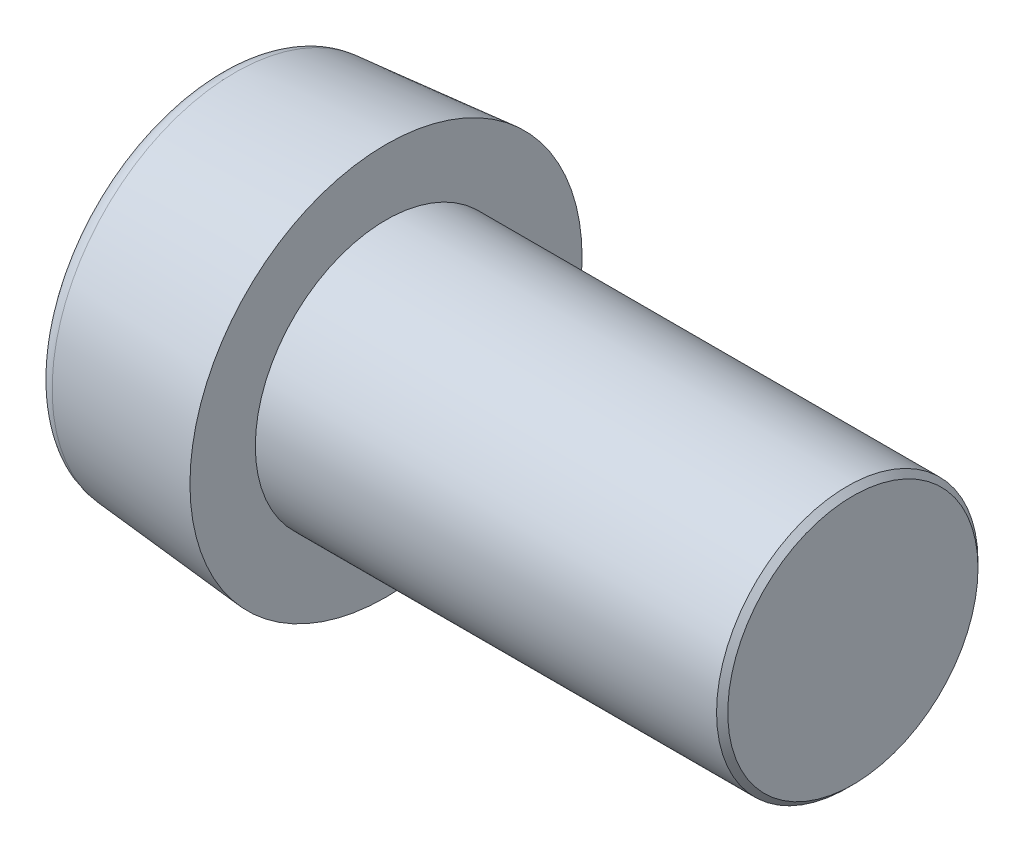
ISO-10303-21;
HEADER;
FILE_DESCRIPTION(('STEP AP214'),'2;1');
FILE_NAME('part.step','',(''),(''),'','','');
FILE_SCHEMA(('AUTOMOTIVE_DESIGN { 1 0 10303 214 1 1 1 1 }'));
ENDSEC;
DATA;
#1=APPLICATION_CONTEXT('core data for automotive mechanical design processes');
#2=APPLICATION_PROTOCOL_DEFINITION('international standard','automotive_design',2000,#1);
#3=PRODUCT_CONTEXT('',#1,'mechanical');
#4=PRODUCT('Part','Part','',(#3));
#5=PRODUCT_RELATED_PRODUCT_CATEGORY('part','',(#4));
#6=PRODUCT_DEFINITION_FORMATION('','',#4);
#7=PRODUCT_DEFINITION_CONTEXT('part definition',#1,'design');
#8=PRODUCT_DEFINITION('design','',#6,#7);
#9=PRODUCT_DEFINITION_SHAPE('','',#8);
#10=(LENGTH_UNIT() NAMED_UNIT(*) SI_UNIT(.MILLI.,.METRE.));
#11=(NAMED_UNIT(*) PLANE_ANGLE_UNIT() SI_UNIT($,.RADIAN.));
#12=(NAMED_UNIT(*) SI_UNIT($,.STERADIAN.) SOLID_ANGLE_UNIT());
#13=UNCERTAINTY_MEASURE_WITH_UNIT(LENGTH_MEASURE(1.E-05),#10,'distance_accuracy_value','');
#14=(GEOMETRIC_REPRESENTATION_CONTEXT(3) GLOBAL_UNCERTAINTY_ASSIGNED_CONTEXT((#13)) GLOBAL_UNIT_ASSIGNED_CONTEXT((#10,
#11,#12)) REPRESENTATION_CONTEXT('',''));
#15=CARTESIAN_POINT('',(0.,0.,0.));
#16=DIRECTION('',(0.,0.,1.));
#17=DIRECTION('',(1.,0.,0.));
#18=AXIS2_PLACEMENT_3D('',#15,#16,#17);
#19=CARTESIAN_POINT('',(0.,0.,0.));
#20=DIRECTION('',(1.,0.,0.));
#21=DIRECTION('',(0.,0.,-1.));
#22=AXIS2_PLACEMENT_3D('',#19,#20,#21);
#23=PLANE('',#22);
#24=CARTESIAN_POINT('',(0.,0.,0.));
#25=DIRECTION('',(1.,0.,0.));
#26=DIRECTION('',(0.,0.,-1.));
#27=AXIS2_PLACEMENT_3D('',#24,#25,#26);
#28=CIRCLE('',#27,8.79627085424926);
#29=CARTESIAN_POINT('',(0.,0.,-8.79627085424926));
#30=VERTEX_POINT('',#29);
#31=EDGE_CURVE('E136',#30,#30,#28,.F.);
#32=ORIENTED_EDGE('',*,*,#31,.T.);
#33=EDGE_LOOP('',(#32));
#34=FACE_BOUND('',#33,.T.);
#35=DIRECTION('',(0.,0.866025403784438,-0.5));
#36=VECTOR('',#35,1.);
#37=CARTESIAN_POINT('',(0.,-4.1,-2.36713610367747));
#38=LINE('',#37,#36);
#39=CARTESIAN_POINT('',(0.,-4.1,-2.36713610367747));
#40=VERTEX_POINT('',#39);
#41=CARTESIAN_POINT('',(0.,0.,-4.73427220735493));
#42=VERTEX_POINT('',#41);
#43=EDGE_CURVE('E52',#40,#42,#38,.T.);
#44=ORIENTED_EDGE('',*,*,#43,.T.);
#45=DIRECTION('',(0.,0.866025403784438,0.5));
#46=VECTOR('',#45,1.);
#47=CARTESIAN_POINT('',(0.,0.,-4.73427220735493));
#48=LINE('',#47,#46);
#49=CARTESIAN_POINT('',(0.,4.1,-2.36713610367746));
#50=VERTEX_POINT('',#49);
#51=EDGE_CURVE('E111',#42,#50,#48,.T.);
#52=ORIENTED_EDGE('',*,*,#51,.T.);
#53=DIRECTION('',(0.,0.,1.));
#54=VECTOR('',#53,1.);
#55=CARTESIAN_POINT('',(0.,4.1,-2.36713610367746));
#56=LINE('',#55,#54);
#57=CARTESIAN_POINT('',(0.,4.1,2.36713610367746));
#58=VERTEX_POINT('',#57);
#59=EDGE_CURVE('E109',#50,#58,#56,.T.);
#60=ORIENTED_EDGE('',*,*,#59,.T.);
#61=DIRECTION('',(0.,-0.866025403784438,0.5));
#62=VECTOR('',#61,1.);
#63=CARTESIAN_POINT('',(0.,4.1,2.36713610367746));
#64=LINE('',#63,#62);
#65=CARTESIAN_POINT('',(0.,0.,4.73427220735493));
#66=VERTEX_POINT('',#65);
#67=EDGE_CURVE('E88',#58,#66,#64,.T.);
#68=ORIENTED_EDGE('',*,*,#67,.T.);
#69=DIRECTION('',(0.,-0.866025403784438,-0.5));
#70=VECTOR('',#69,1.);
#71=CARTESIAN_POINT('',(0.,0.,4.73427220735493));
#72=LINE('',#71,#70);
#73=CARTESIAN_POINT('',(0.,-4.1,2.36713610367746));
#74=VERTEX_POINT('',#73);
#75=EDGE_CURVE('E99',#66,#74,#72,.T.);
#76=ORIENTED_EDGE('',*,*,#75,.T.);
#77=DIRECTION('',(0.,0.,-1.));
#78=VECTOR('',#77,1.);
#79=CARTESIAN_POINT('',(0.,-4.1,2.36713610367746));
#80=LINE('',#79,#78);
#81=EDGE_CURVE('E105',#74,#40,#80,.T.);
#82=ORIENTED_EDGE('',*,*,#81,.T.);
#83=EDGE_LOOP('',(#44,#52,#60,#68,#76,#82));
#84=FACE_BOUND('',#83,.T.);
#85=ADVANCED_FACE('F37',(#34,#84),#23,.F.);
#86=CARTESIAN_POINT('',(9.,0.,0.));
#87=DIRECTION('',(1.,0.,0.));
#88=DIRECTION('',(0.,0.,-1.));
#89=AXIS2_PLACEMENT_3D('',#86,#87,#88);
#90=PLANE('',#89);
#91=CARTESIAN_POINT('',(9.,0.,0.));
#92=DIRECTION('',(1.,0.,0.));
#93=DIRECTION('',(0.,0.,-1.));
#94=AXIS2_PLACEMENT_3D('',#91,#92,#93);
#95=CIRCLE('',#94,10.5);
#96=CARTESIAN_POINT('',(9.,0.,-10.5));
#97=VERTEX_POINT('',#96);
#98=EDGE_CURVE('E129',#97,#97,#95,.T.);
#99=ORIENTED_EDGE('',*,*,#98,.T.);
#100=EDGE_LOOP('',(#99));
#101=FACE_BOUND('',#100,.T.);
#102=CARTESIAN_POINT('',(9.,0.,0.));
#103=DIRECTION('',(1.,0.,0.));
#104=DIRECTION('',(0.,0.,-1.));
#105=AXIS2_PLACEMENT_3D('',#102,#103,#104);
#106=CIRCLE('',#105,7.);
#107=CARTESIAN_POINT('',(9.,0.,-7.));
#108=VERTEX_POINT('',#107);
#109=EDGE_CURVE('E126',#108,#108,#106,.T.);
#110=ORIENTED_EDGE('',*,*,#109,.F.);
#111=EDGE_LOOP('',(#110));
#112=FACE_BOUND('',#111,.T.);
#113=ADVANCED_FACE('F153',(#101,#112),#90,.T.);
#114=CARTESIAN_POINT('',(9.,0.,0.));
#115=DIRECTION('',(1.,0.,0.));
#116=DIRECTION('',(0.,0.,-1.));
#117=AXIS2_PLACEMENT_3D('',#114,#115,#116);
#118=CONICAL_SURFACE('',#117,10.5,0.0872664625997167);
#119=CARTESIAN_POINT('',(0.912844257252343,0.,0.));
#120=DIRECTION('',(1.,0.,0.));
#121=DIRECTION('',(0.,0.,-1.));
#122=AXIS2_PLACEMENT_3D('',#119,#120,#121);
#123=CIRCLE('',#122,9.79246555234101);
#124=CARTESIAN_POINT('',(0.912844257252343,0.,-9.79246555234101));
#125=VERTEX_POINT('',#124);
#126=EDGE_CURVE('E133',#125,#125,#123,.T.);
#127=ORIENTED_EDGE('',*,*,#126,.T.);
#128=EDGE_LOOP('',(#127));
#129=FACE_BOUND('',#128,.T.);
#130=ORIENTED_EDGE('',*,*,#98,.F.);
#131=EDGE_LOOP('',(#130));
#132=FACE_BOUND('',#131,.T.);
#133=ADVANCED_FACE('F159',(#129,#132),#118,.T.);
#134=CARTESIAN_POINT('',(34.,0.,0.));
#135=DIRECTION('',(-1.,0.,0.));
#136=DIRECTION('',(0.,0.,1.));
#137=AXIS2_PLACEMENT_3D('',#134,#135,#136);
#138=CYLINDRICAL_SURFACE('',#137,7.);
#139=CARTESIAN_POINT('',(33.7,0.,0.));
#140=DIRECTION('',(1.,0.,0.));
#141=DIRECTION('',(0.,0.,-1.));
#142=AXIS2_PLACEMENT_3D('',#139,#140,#141);
#143=CIRCLE('',#142,7.);
#144=CARTESIAN_POINT('',(33.7,0.,-7.));
#145=VERTEX_POINT('',#144);
#146=EDGE_CURVE('E11',#145,#145,#143,.F.);
#147=ORIENTED_EDGE('',*,*,#146,.T.);
#148=EDGE_LOOP('',(#147));
#149=FACE_BOUND('',#148,.T.);
#150=ORIENTED_EDGE('',*,*,#109,.T.);
#151=EDGE_LOOP('',(#150));
#152=FACE_BOUND('',#151,.T.);
#153=ADVANCED_FACE('F163',(#149,#152),#138,.T.);
#154=CARTESIAN_POINT('',(34.,0.,0.));
#155=DIRECTION('',(1.,0.,0.));
#156=DIRECTION('',(0.,0.,-1.));
#157=AXIS2_PLACEMENT_3D('',#154,#155,#156);
#158=PLANE('',#157);
#159=CARTESIAN_POINT('',(34.,0.,0.));
#160=DIRECTION('',(1.,0.,0.));
#161=DIRECTION('',(0.,0.,-1.));
#162=AXIS2_PLACEMENT_3D('',#159,#160,#161);
#163=CIRCLE('',#162,6.7);
#164=CARTESIAN_POINT('',(34.,0.,-6.7));
#165=VERTEX_POINT('',#164);
#166=EDGE_CURVE('E45',#165,#165,#163,.T.);
#167=ORIENTED_EDGE('',*,*,#166,.T.);
#168=EDGE_LOOP('',(#167));
#169=FACE_BOUND('',#168,.T.);
#170=ADVANCED_FACE('F141',(#169),#158,.T.);
#171=CARTESIAN_POINT('',(4.,-4.1,-2.36713610367747));
#172=DIRECTION('',(0.,0.5,0.866025403784439));
#173=DIRECTION('',(0.,-0.866025403784438,0.5));
#174=AXIS2_PLACEMENT_3D('',#171,#172,#173);
#175=PLANE('',#174);
#176=ORIENTED_EDGE('',*,*,#43,.F.);
#177=DIRECTION('',(-1.,0.,0.));
#178=VECTOR('',#177,1.);
#179=CARTESIAN_POINT('',(4.,-4.1,-2.36713610367747));
#180=LINE('',#179,#178);
#181=CARTESIAN_POINT('',(4.,-4.1,-2.36713610367747));
#182=VERTEX_POINT('',#181);
#183=EDGE_CURVE('E117',#182,#40,#180,.T.);
#184=ORIENTED_EDGE('',*,*,#183,.F.);
#185=DIRECTION('',(0.,0.866025403784438,-0.5));
#186=VECTOR('',#185,1.);
#187=CARTESIAN_POINT('',(4.,-4.1,-2.36713610367747));
#188=LINE('',#187,#186);
#189=CARTESIAN_POINT('',(4.,0.,-4.73427220735493));
#190=VERTEX_POINT('',#189);
#191=EDGE_CURVE('E116',#182,#190,#188,.T.);
#192=ORIENTED_EDGE('',*,*,#191,.T.);
#193=DIRECTION('',(-1.,0.,0.));
#194=VECTOR('',#193,1.);
#195=CARTESIAN_POINT('',(4.,0.,-4.73427220735493));
#196=LINE('',#195,#194);
#197=EDGE_CURVE('E124',#190,#42,#196,.T.);
#198=ORIENTED_EDGE('',*,*,#197,.T.);
#199=EDGE_LOOP('',(#176,#184,#192,#198));
#200=FACE_BOUND('',#199,.T.);
#201=ADVANCED_FACE('F182',(#200),#175,.T.);
#202=CARTESIAN_POINT('',(4.,0.,-4.73427220735493));
#203=DIRECTION('',(0.,-0.5,0.866025403784438));
#204=DIRECTION('',(0.,-0.866025403784438,-0.5));
#205=AXIS2_PLACEMENT_3D('',#202,#203,#204);
#206=PLANE('',#205);
#207=ORIENTED_EDGE('',*,*,#51,.F.);
#208=ORIENTED_EDGE('',*,*,#197,.F.);
#209=DIRECTION('',(0.,0.866025403784438,0.5));
#210=VECTOR('',#209,1.);
#211=CARTESIAN_POINT('',(4.,0.,-4.73427220735493));
#212=LINE('',#211,#210);
#213=CARTESIAN_POINT('',(4.,4.1,-2.36713610367746));
#214=VERTEX_POINT('',#213);
#215=EDGE_CURVE('E255',#190,#214,#212,.T.);
#216=ORIENTED_EDGE('',*,*,#215,.T.);
#217=DIRECTION('',(-1.,0.,0.));
#218=VECTOR('',#217,1.);
#219=CARTESIAN_POINT('',(4.,4.1,-2.36713610367746));
#220=LINE('',#219,#218);
#221=EDGE_CURVE('E122',#214,#50,#220,.T.);
#222=ORIENTED_EDGE('',*,*,#221,.T.);
#223=EDGE_LOOP('',(#207,#208,#216,#222));
#224=FACE_BOUND('',#223,.T.);
#225=ADVANCED_FACE('F186',(#224),#206,.T.);
#226=CARTESIAN_POINT('',(4.,4.1,-2.36713610367746));
#227=DIRECTION('',(0.,-1.,0.));
#228=DIRECTION('',(0.,0.,-1.));
#229=AXIS2_PLACEMENT_3D('',#226,#227,#228);
#230=PLANE('',#229);
#231=ORIENTED_EDGE('',*,*,#59,.F.);
#232=ORIENTED_EDGE('',*,*,#221,.F.);
#233=DIRECTION('',(0.,0.,1.));
#234=VECTOR('',#233,1.);
#235=CARTESIAN_POINT('',(4.,4.1,-2.36713610367746));
#236=LINE('',#235,#234);
#237=CARTESIAN_POINT('',(4.,4.1,2.36713610367746));
#238=VERTEX_POINT('',#237);
#239=EDGE_CURVE('E61',#214,#238,#236,.T.);
#240=ORIENTED_EDGE('',*,*,#239,.T.);
#241=DIRECTION('',(-1.,0.,0.));
#242=VECTOR('',#241,1.);
#243=CARTESIAN_POINT('',(4.,4.1,2.36713610367746));
#244=LINE('',#243,#242);
#245=EDGE_CURVE('E95',#238,#58,#244,.T.);
#246=ORIENTED_EDGE('',*,*,#245,.T.);
#247=EDGE_LOOP('',(#231,#232,#240,#246));
#248=FACE_BOUND('',#247,.T.);
#249=ADVANCED_FACE('F191',(#248),#230,.T.);
#250=CARTESIAN_POINT('',(4.,4.1,2.36713610367746));
#251=DIRECTION('',(0.,-0.5,-0.866025403784439));
#252=DIRECTION('',(0.,0.866025403784438,-0.5));
#253=AXIS2_PLACEMENT_3D('',#250,#251,#252);
#254=PLANE('',#253);
#255=ORIENTED_EDGE('',*,*,#67,.F.);
#256=ORIENTED_EDGE('',*,*,#245,.F.);
#257=DIRECTION('',(0.,-0.866025403784438,0.5));
#258=VECTOR('',#257,1.);
#259=CARTESIAN_POINT('',(4.,4.1,2.36713610367746));
#260=LINE('',#259,#258);
#261=CARTESIAN_POINT('',(4.,0.,4.73427220735493));
#262=VERTEX_POINT('',#261);
#263=EDGE_CURVE('E92',#238,#262,#260,.T.);
#264=ORIENTED_EDGE('',*,*,#263,.T.);
#265=DIRECTION('',(-1.,0.,0.));
#266=VECTOR('',#265,1.);
#267=CARTESIAN_POINT('',(4.,0.,4.73427220735493));
#268=LINE('',#267,#266);
#269=EDGE_CURVE('E83',#262,#66,#268,.T.);
#270=ORIENTED_EDGE('',*,*,#269,.T.);
#271=EDGE_LOOP('',(#255,#256,#264,#270));
#272=FACE_BOUND('',#271,.T.);
#273=ADVANCED_FACE('F85',(#272),#254,.T.);
#274=CARTESIAN_POINT('',(4.,0.,4.73427220735493));
#275=DIRECTION('',(0.,0.5,-0.866025403784439));
#276=DIRECTION('',(0.,0.866025403784439,0.5));
#277=AXIS2_PLACEMENT_3D('',#274,#275,#276);
#278=PLANE('',#277);
#279=ORIENTED_EDGE('',*,*,#75,.F.);
#280=ORIENTED_EDGE('',*,*,#269,.F.);
#281=DIRECTION('',(0.,-0.866025403784438,-0.5));
#282=VECTOR('',#281,1.);
#283=CARTESIAN_POINT('',(4.,0.,4.73427220735493));
#284=LINE('',#283,#282);
#285=CARTESIAN_POINT('',(4.,-4.1,2.36713610367746));
#286=VERTEX_POINT('',#285);
#287=EDGE_CURVE('E230',#262,#286,#284,.T.);
#288=ORIENTED_EDGE('',*,*,#287,.T.);
#289=DIRECTION('',(-1.,0.,0.));
#290=VECTOR('',#289,1.);
#291=CARTESIAN_POINT('',(4.,-4.1,2.36713610367746));
#292=LINE('',#291,#290);
#293=EDGE_CURVE('E96',#286,#74,#292,.T.);
#294=ORIENTED_EDGE('',*,*,#293,.T.);
#295=EDGE_LOOP('',(#279,#280,#288,#294));
#296=FACE_BOUND('',#295,.T.);
#297=ADVANCED_FACE('F100',(#296),#278,.T.);
#298=CARTESIAN_POINT('',(4.,-4.1,2.36713610367746));
#299=DIRECTION('',(0.,1.,0.));
#300=DIRECTION('',(0.,0.,1.));
#301=AXIS2_PLACEMENT_3D('',#298,#299,#300);
#302=PLANE('',#301);
#303=ORIENTED_EDGE('',*,*,#81,.F.);
#304=ORIENTED_EDGE('',*,*,#293,.F.);
#305=DIRECTION('',(0.,0.,-1.));
#306=VECTOR('',#305,1.);
#307=CARTESIAN_POINT('',(4.,-4.1,2.36713610367746));
#308=LINE('',#307,#306);
#309=EDGE_CURVE('E119',#286,#182,#308,.T.);
#310=ORIENTED_EDGE('',*,*,#309,.T.);
#311=ORIENTED_EDGE('',*,*,#183,.T.);
#312=EDGE_LOOP('',(#303,#304,#310,#311));
#313=FACE_BOUND('',#312,.T.);
#314=ADVANCED_FACE('F200',(#313),#302,.T.);
#315=CARTESIAN_POINT('',(4.,0.,4.73427220735493));
#316=DIRECTION('',(0.86602540378444,-0.249999999999999,0.433012701892217));
#317=DIRECTION('',(0.447213595499956,0.,-0.894427190999917));
#318=AXIS2_PLACEMENT_3D('',#315,#316,#317);
#319=PLANE('',#318);
#320=ORIENTED_EDGE('',*,*,#287,.F.);
#321=DIRECTION('',(-0.447213595499956,0.,0.894427190999917));
#322=VECTOR('',#321,1.);
#323=CARTESIAN_POINT('',(4.,0.,4.73427220735493));
#324=LINE('',#323,#322);
#325=CARTESIAN_POINT('',(6.36713610367745,0.,0.));
#326=VERTEX_POINT('',#325);
#327=EDGE_CURVE('E232',#326,#262,#324,.T.);
#328=ORIENTED_EDGE('',*,*,#327,.F.);
#329=DIRECTION('',(-0.447213595499956,-0.774596669241484,0.447213595499958));
#330=VECTOR('',#329,1.);
#331=CARTESIAN_POINT('',(4.,-4.1,2.36713610367746));
#332=LINE('',#331,#330);
#333=EDGE_CURVE('E235',#326,#286,#332,.T.);
#334=ORIENTED_EDGE('',*,*,#333,.T.);
#335=EDGE_LOOP('',(#320,#328,#334));
#336=FACE_BOUND('',#335,.T.);
#337=ADVANCED_FACE('F203',(#336),#319,.F.);
#338=CARTESIAN_POINT('',(4.,-4.1,2.36713610367746));
#339=DIRECTION('',(0.86602540378444,-0.499999999999998,0.));
#340=DIRECTION('',(0.499999999999998,0.86602540378444,0.));
#341=AXIS2_PLACEMENT_3D('',#338,#339,#340);
#342=PLANE('',#341);
#343=ORIENTED_EDGE('',*,*,#309,.F.);
#344=ORIENTED_EDGE('',*,*,#333,.F.);
#345=DIRECTION('',(-0.447213595499956,-0.774596669241484,-0.447213595499959));
#346=VECTOR('',#345,1.);
#347=CARTESIAN_POINT('',(4.,-4.1,-2.36713610367747));
#348=LINE('',#347,#346);
#349=EDGE_CURVE('E259',#326,#182,#348,.T.);
#350=ORIENTED_EDGE('',*,*,#349,.T.);
#351=EDGE_LOOP('',(#343,#344,#350));
#352=FACE_BOUND('',#351,.T.);
#353=ADVANCED_FACE('F205',(#352),#342,.F.);
#354=CARTESIAN_POINT('',(4.,-4.1,-2.36713610367747));
#355=DIRECTION('',(0.86602540378444,-0.249999999999999,-0.433012701892218));
#356=DIRECTION('',(-0.447213595499956,0.,-0.894427190999917));
#357=AXIS2_PLACEMENT_3D('',#354,#355,#356);
#358=PLANE('',#357);
#359=ORIENTED_EDGE('',*,*,#191,.F.);
#360=ORIENTED_EDGE('',*,*,#349,.F.);
#361=DIRECTION('',(-0.447213595499956,0.,-0.894427190999917));
#362=VECTOR('',#361,1.);
#363=CARTESIAN_POINT('',(4.,0.,-4.73427220735493));
#364=LINE('',#363,#362);
#365=EDGE_CURVE('E267',#326,#190,#364,.T.);
#366=ORIENTED_EDGE('',*,*,#365,.T.);
#367=EDGE_LOOP('',(#359,#360,#366));
#368=FACE_BOUND('',#367,.T.);
#369=ADVANCED_FACE('F208',(#368),#358,.F.);
#370=CARTESIAN_POINT('',(4.,0.,-4.73427220735493));
#371=DIRECTION('',(0.86602540378444,0.249999999999999,-0.433012701892218));
#372=DIRECTION('',(-0.447213595499956,0.,-0.894427190999917));
#373=AXIS2_PLACEMENT_3D('',#370,#371,#372);
#374=PLANE('',#373);
#375=ORIENTED_EDGE('',*,*,#215,.F.);
#376=ORIENTED_EDGE('',*,*,#365,.F.);
#377=DIRECTION('',(-0.447213595499956,0.774596669241484,-0.447213595499958));
#378=VECTOR('',#377,1.);
#379=CARTESIAN_POINT('',(4.,4.1,-2.36713610367746));
#380=LINE('',#379,#378);
#381=EDGE_CURVE('E269',#326,#214,#380,.T.);
#382=ORIENTED_EDGE('',*,*,#381,.T.);
#383=EDGE_LOOP('',(#375,#376,#382));
#384=FACE_BOUND('',#383,.T.);
#385=ADVANCED_FACE('F212',(#384),#374,.F.);
#386=CARTESIAN_POINT('',(4.,4.1,-2.36713610367746));
#387=DIRECTION('',(0.86602540378444,0.499999999999998,0.));
#388=DIRECTION('',(-0.499999999999998,0.86602540378444,0.));
#389=AXIS2_PLACEMENT_3D('',#386,#387,#388);
#390=PLANE('',#389);
#391=ORIENTED_EDGE('',*,*,#239,.F.);
#392=ORIENTED_EDGE('',*,*,#381,.F.);
#393=DIRECTION('',(-0.447213595499956,0.774596669241484,0.447213595499958));
#394=VECTOR('',#393,1.);
#395=CARTESIAN_POINT('',(4.,4.1,2.36713610367746));
#396=LINE('',#395,#394);
#397=EDGE_CURVE('E263',#326,#238,#396,.T.);
#398=ORIENTED_EDGE('',*,*,#397,.T.);
#399=EDGE_LOOP('',(#391,#392,#398));
#400=FACE_BOUND('',#399,.T.);
#401=ADVANCED_FACE('F216',(#400),#390,.F.);
#402=CARTESIAN_POINT('',(4.,4.1,2.36713610367746));
#403=DIRECTION('',(0.86602540378444,0.249999999999999,0.433012701892218));
#404=DIRECTION('',(0.447213595499956,0.,-0.894427190999917));
#405=AXIS2_PLACEMENT_3D('',#402,#403,#404);
#406=PLANE('',#405);
#407=ORIENTED_EDGE('',*,*,#263,.F.);
#408=ORIENTED_EDGE('',*,*,#397,.F.);
#409=ORIENTED_EDGE('',*,*,#327,.T.);
#410=EDGE_LOOP('',(#407,#408,#409));
#411=FACE_BOUND('',#410,.T.);
#412=ADVANCED_FACE('F149',(#411),#406,.F.);
#413=CARTESIAN_POINT('',(1.,0.,0.));
#414=DIRECTION('',(1.,0.,0.));
#415=DIRECTION('',(0.,0.,-1.));
#416=AXIS2_PLACEMENT_3D('',#413,#414,#415);
#417=TOROIDAL_SURFACE('',#416,8.79627085424926,1.);
#418=ORIENTED_EDGE('',*,*,#31,.F.);
#419=EDGE_LOOP('',(#418));
#420=FACE_BOUND('',#419,.T.);
#421=ORIENTED_EDGE('',*,*,#126,.F.);
#422=EDGE_LOOP('',(#421));
#423=FACE_BOUND('',#422,.T.);
#424=ADVANCED_FACE('F144',(#420,#423),#417,.T.);
#425=CARTESIAN_POINT('',(34.,0.,0.));
#426=DIRECTION('',(-1.,0.,0.));
#427=DIRECTION('',(0.,0.,1.));
#428=AXIS2_PLACEMENT_3D('',#425,#426,#427);
#429=CONICAL_SURFACE('',#428,6.7,0.785398163397451);
#430=ORIENTED_EDGE('',*,*,#146,.F.);
#431=EDGE_LOOP('',(#430));
#432=FACE_BOUND('',#431,.T.);
#433=ORIENTED_EDGE('',*,*,#166,.F.);
#434=EDGE_LOOP('',(#433));
#435=FACE_BOUND('',#434,.T.);
#436=ADVANCED_FACE('F39',(#432,#435),#429,.T.);
#437=CLOSED_SHELL('',(#85,#113,#133,#153,#170,#201,#225,#249,#273,#297,#314,#337,#353,#369,#385,
#401,#412,#424,#436));
#438=MANIFOLD_SOLID_BREP('B2',#437);
#439=ADVANCED_BREP_SHAPE_REPRESENTATION('',(#18,#438),#14);
#440=SHAPE_DEFINITION_REPRESENTATION(#9,#439);
ENDSEC;
END-ISO-10303-21;
